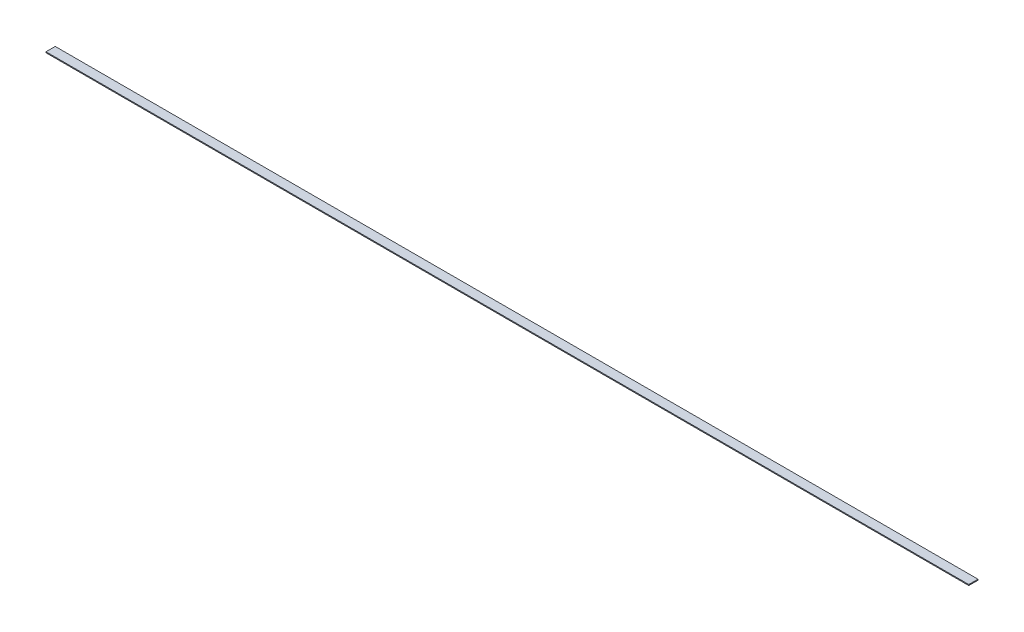
ISO-10303-21;
HEADER;
FILE_DESCRIPTION(('STEP AP214'),'2;1');
FILE_NAME('part.step','',(''),(''),'','','');
FILE_SCHEMA(('AUTOMOTIVE_DESIGN { 1 0 10303 214 1 1 1 1 }'));
ENDSEC;
DATA;
#1=APPLICATION_CONTEXT('core data for automotive mechanical design processes');
#2=APPLICATION_PROTOCOL_DEFINITION('international standard','automotive_design',2000,#1);
#3=PRODUCT_CONTEXT('',#1,'mechanical');
#4=PRODUCT('Part','Part','',(#3));
#5=PRODUCT_RELATED_PRODUCT_CATEGORY('part','',(#4));
#6=PRODUCT_DEFINITION_FORMATION('','',#4);
#7=PRODUCT_DEFINITION_CONTEXT('part definition',#1,'design');
#8=PRODUCT_DEFINITION('design','',#6,#7);
#9=PRODUCT_DEFINITION_SHAPE('','',#8);
#10=(LENGTH_UNIT() NAMED_UNIT(*) SI_UNIT(.MILLI.,.METRE.));
#11=(NAMED_UNIT(*) PLANE_ANGLE_UNIT() SI_UNIT($,.RADIAN.));
#12=(NAMED_UNIT(*) SI_UNIT($,.STERADIAN.) SOLID_ANGLE_UNIT());
#13=UNCERTAINTY_MEASURE_WITH_UNIT(LENGTH_MEASURE(1.E-05),#10,'distance_accuracy_value','');
#14=(GEOMETRIC_REPRESENTATION_CONTEXT(3) GLOBAL_UNCERTAINTY_ASSIGNED_CONTEXT((#13)) GLOBAL_UNIT_ASSIGNED_CONTEXT((#10,
#11,#12)) REPRESENTATION_CONTEXT('',''));
#15=CARTESIAN_POINT('',(0.,0.,0.));
#16=DIRECTION('',(0.,0.,1.));
#17=DIRECTION('',(1.,0.,0.));
#18=AXIS2_PLACEMENT_3D('',#15,#16,#17);
#19=CARTESIAN_POINT('',(0.,0.,10.));
#20=DIRECTION('',(1.,0.,0.));
#21=DIRECTION('',(0.,0.,-1.));
#22=AXIS2_PLACEMENT_3D('',#19,#20,#21);
#23=PLANE('',#22);
#24=DIRECTION('',(0.,-1.,0.));
#25=VECTOR('',#24,1.);
#26=CARTESIAN_POINT('',(0.,0.,0.));
#27=LINE('',#26,#25);
#28=CARTESIAN_POINT('',(0.,1.,0.));
#29=VERTEX_POINT('',#28);
#30=CARTESIAN_POINT('',(0.,0.,0.));
#31=VERTEX_POINT('',#30);
#32=EDGE_CURVE('E95',#29,#31,#27,.T.);
#33=ORIENTED_EDGE('',*,*,#32,.T.);
#34=DIRECTION('',(0.,0.,-1.));
#35=VECTOR('',#34,1.);
#36=CARTESIAN_POINT('',(0.,0.,10.));
#37=LINE('',#36,#35);
#38=CARTESIAN_POINT('',(0.,0.,10.));
#39=VERTEX_POINT('',#38);
#40=EDGE_CURVE('E11',#39,#31,#37,.T.);
#41=ORIENTED_EDGE('',*,*,#40,.F.);
#42=DIRECTION('',(0.,-1.,0.));
#43=VECTOR('',#42,1.);
#44=CARTESIAN_POINT('',(0.,0.,10.));
#45=LINE('',#44,#43);
#46=CARTESIAN_POINT('',(0.,1.,10.));
#47=VERTEX_POINT('',#46);
#48=EDGE_CURVE('E83',#47,#39,#45,.T.);
#49=ORIENTED_EDGE('',*,*,#48,.F.);
#50=DIRECTION('',(0.,0.,-1.));
#51=VECTOR('',#50,1.);
#52=CARTESIAN_POINT('',(0.,1.,10.));
#53=LINE('',#52,#51);
#54=EDGE_CURVE('E91',#47,#29,#53,.T.);
#55=ORIENTED_EDGE('',*,*,#54,.T.);
#56=EDGE_LOOP('',(#33,#41,#49,#55));
#57=FACE_BOUND('',#56,.T.);
#58=ADVANCED_FACE('F32',(#57),#23,.F.);
#59=CARTESIAN_POINT('',(0.,0.,10.));
#60=DIRECTION('',(0.,1.,0.));
#61=DIRECTION('',(0.,0.,1.));
#62=AXIS2_PLACEMENT_3D('',#59,#60,#61);
#63=PLANE('',#62);
#64=DIRECTION('',(1.,0.,0.));
#65=VECTOR('',#64,1.);
#66=CARTESIAN_POINT('',(0.,0.,0.));
#67=LINE('',#66,#65);
#68=CARTESIAN_POINT('',(1000.,0.,0.));
#69=VERTEX_POINT('',#68);
#70=EDGE_CURVE('E87',#31,#69,#67,.T.);
#71=ORIENTED_EDGE('',*,*,#70,.T.);
#72=DIRECTION('',(0.,0.,-1.));
#73=VECTOR('',#72,1.);
#74=CARTESIAN_POINT('',(1000.,0.,10.));
#75=LINE('',#74,#73);
#76=CARTESIAN_POINT('',(1000.,0.,10.));
#77=VERTEX_POINT('',#76);
#78=EDGE_CURVE('E40',#77,#69,#75,.T.);
#79=ORIENTED_EDGE('',*,*,#78,.F.);
#80=DIRECTION('',(1.,0.,0.));
#81=VECTOR('',#80,1.);
#82=CARTESIAN_POINT('',(0.,0.,10.));
#83=LINE('',#82,#81);
#84=EDGE_CURVE('E78',#39,#77,#83,.T.);
#85=ORIENTED_EDGE('',*,*,#84,.F.);
#86=ORIENTED_EDGE('',*,*,#40,.T.);
#87=EDGE_LOOP('',(#71,#79,#85,#86));
#88=FACE_BOUND('',#87,.T.);
#89=ADVANCED_FACE('F86',(#88),#63,.F.);
#90=CARTESIAN_POINT('',(1000.,0.,10.));
#91=DIRECTION('',(-1.,0.,0.));
#92=DIRECTION('',(0.,0.,1.));
#93=AXIS2_PLACEMENT_3D('',#90,#91,#92);
#94=PLANE('',#93);
#95=DIRECTION('',(0.,1.,0.));
#96=VECTOR('',#95,1.);
#97=CARTESIAN_POINT('',(1000.,0.,0.));
#98=LINE('',#97,#96);
#99=CARTESIAN_POINT('',(1000.,1.,0.));
#100=VERTEX_POINT('',#99);
#101=EDGE_CURVE('E65',#69,#100,#98,.T.);
#102=ORIENTED_EDGE('',*,*,#101,.T.);
#103=DIRECTION('',(0.,0.,-1.));
#104=VECTOR('',#103,1.);
#105=CARTESIAN_POINT('',(1000.,1.,10.));
#106=LINE('',#105,#104);
#107=CARTESIAN_POINT('',(1000.,1.,10.));
#108=VERTEX_POINT('',#107);
#109=EDGE_CURVE('E88',#108,#100,#106,.T.);
#110=ORIENTED_EDGE('',*,*,#109,.F.);
#111=DIRECTION('',(0.,1.,0.));
#112=VECTOR('',#111,1.);
#113=CARTESIAN_POINT('',(1000.,0.,10.));
#114=LINE('',#113,#112);
#115=EDGE_CURVE('E81',#77,#108,#114,.T.);
#116=ORIENTED_EDGE('',*,*,#115,.F.);
#117=ORIENTED_EDGE('',*,*,#78,.T.);
#118=EDGE_LOOP('',(#102,#110,#116,#117));
#119=FACE_BOUND('',#118,.T.);
#120=ADVANCED_FACE('F89',(#119),#94,.F.);
#121=CARTESIAN_POINT('',(0.,1.,10.));
#122=DIRECTION('',(0.,-1.,0.));
#123=DIRECTION('',(0.,0.,-1.));
#124=AXIS2_PLACEMENT_3D('',#121,#122,#123);
#125=PLANE('',#124);
#126=DIRECTION('',(-1.,0.,0.));
#127=VECTOR('',#126,1.);
#128=CARTESIAN_POINT('',(0.,1.,0.));
#129=LINE('',#128,#127);
#130=EDGE_CURVE('E71',#100,#29,#129,.T.);
#131=ORIENTED_EDGE('',*,*,#130,.T.);
#132=ORIENTED_EDGE('',*,*,#54,.F.);
#133=DIRECTION('',(-1.,0.,0.));
#134=VECTOR('',#133,1.);
#135=CARTESIAN_POINT('',(0.,1.,10.));
#136=LINE('',#135,#134);
#137=EDGE_CURVE('E48',#108,#47,#136,.T.);
#138=ORIENTED_EDGE('',*,*,#137,.F.);
#139=ORIENTED_EDGE('',*,*,#109,.T.);
#140=EDGE_LOOP('',(#131,#132,#138,#139));
#141=FACE_BOUND('',#140,.T.);
#142=ADVANCED_FACE('F102',(#141),#125,.F.);
#143=CARTESIAN_POINT('',(0.,0.,10.));
#144=DIRECTION('',(0.,0.,-1.));
#145=DIRECTION('',(-1.,0.,0.));
#146=AXIS2_PLACEMENT_3D('',#143,#144,#145);
#147=PLANE('',#146);
#148=ORIENTED_EDGE('',*,*,#48,.T.);
#149=ORIENTED_EDGE('',*,*,#84,.T.);
#150=ORIENTED_EDGE('',*,*,#115,.T.);
#151=ORIENTED_EDGE('',*,*,#137,.T.);
#152=EDGE_LOOP('',(#148,#149,#150,#151));
#153=FACE_BOUND('',#152,.T.);
#154=ADVANCED_FACE('F79',(#153),#147,.F.);
#155=CARTESIAN_POINT('',(0.,0.,0.));
#156=DIRECTION('',(0.,0.,-1.));
#157=DIRECTION('',(-1.,0.,0.));
#158=AXIS2_PLACEMENT_3D('',#155,#156,#157);
#159=PLANE('',#158);
#160=ORIENTED_EDGE('',*,*,#32,.F.);
#161=ORIENTED_EDGE('',*,*,#130,.F.);
#162=ORIENTED_EDGE('',*,*,#101,.F.);
#163=ORIENTED_EDGE('',*,*,#70,.F.);
#164=EDGE_LOOP('',(#160,#161,#162,#163));
#165=FACE_BOUND('',#164,.T.);
#166=ADVANCED_FACE('F105',(#165),#159,.T.);
#167=CLOSED_SHELL('',(#58,#89,#120,#142,#154,#166));
#168=MANIFOLD_SOLID_BREP('B2',#167);
#169=ADVANCED_BREP_SHAPE_REPRESENTATION('',(#18,#168),#14);
#170=SHAPE_DEFINITION_REPRESENTATION(#9,#169);
ENDSEC;
END-ISO-10303-21;
